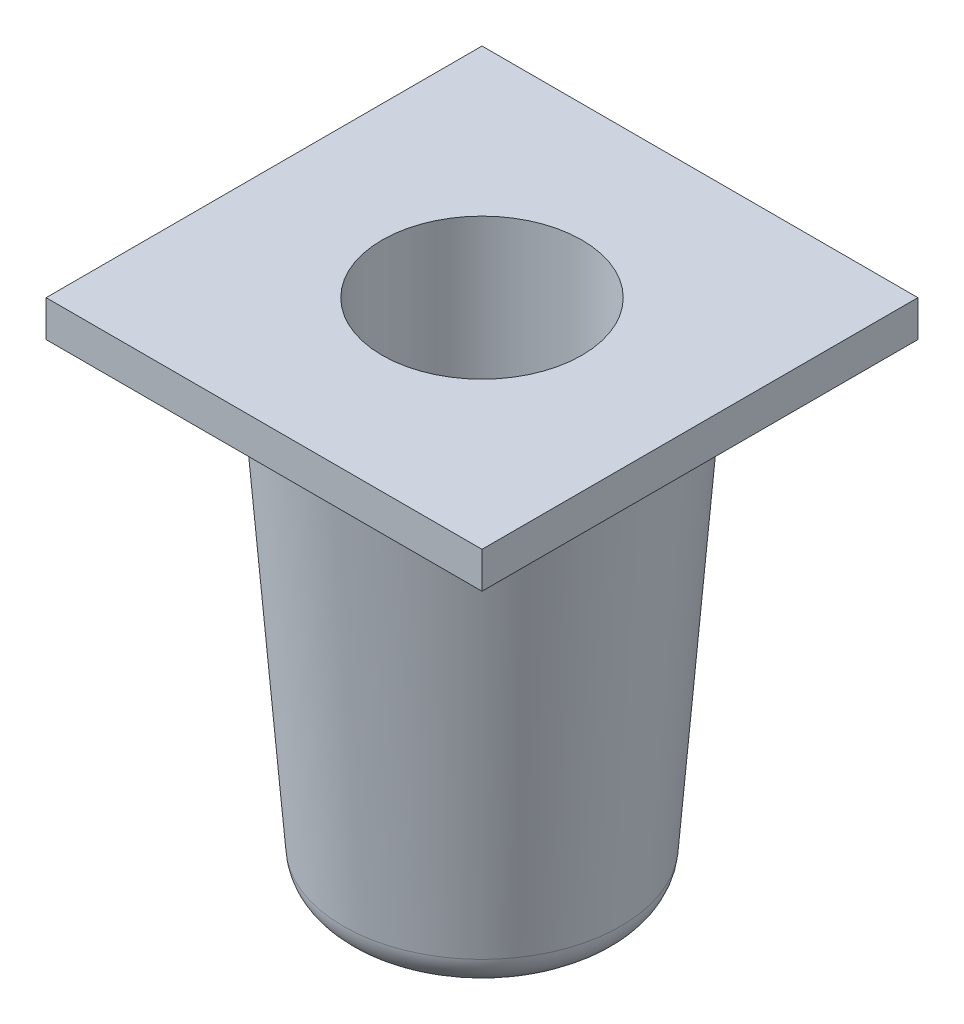
ISO-10303-21;
HEADER;
FILE_DESCRIPTION(('STEP AP214'),'2;1');
FILE_NAME('part.step','',(''),(''),'','','');
FILE_SCHEMA(('AUTOMOTIVE_DESIGN { 1 0 10303 214 1 1 1 1 }'));
ENDSEC;
DATA;
#1=APPLICATION_CONTEXT('core data for automotive mechanical design processes');
#2=APPLICATION_PROTOCOL_DEFINITION('international standard','automotive_design',2000,#1);
#3=PRODUCT_CONTEXT('',#1,'mechanical');
#4=PRODUCT('Part','Part','',(#3));
#5=PRODUCT_RELATED_PRODUCT_CATEGORY('part','',(#4));
#6=PRODUCT_DEFINITION_FORMATION('','',#4);
#7=PRODUCT_DEFINITION_CONTEXT('part definition',#1,'design');
#8=PRODUCT_DEFINITION('design','',#6,#7);
#9=PRODUCT_DEFINITION_SHAPE('','',#8);
#10=(LENGTH_UNIT() NAMED_UNIT(*) SI_UNIT(.MILLI.,.METRE.));
#11=(NAMED_UNIT(*) PLANE_ANGLE_UNIT() SI_UNIT($,.RADIAN.));
#12=(NAMED_UNIT(*) SI_UNIT($,.STERADIAN.) SOLID_ANGLE_UNIT());
#13=UNCERTAINTY_MEASURE_WITH_UNIT(LENGTH_MEASURE(1.E-05),#10,'distance_accuracy_value','');
#14=(GEOMETRIC_REPRESENTATION_CONTEXT(3) GLOBAL_UNCERTAINTY_ASSIGNED_CONTEXT((#13)) GLOBAL_UNIT_ASSIGNED_CONTEXT((#10,
#11,#12)) REPRESENTATION_CONTEXT('',''));
#15=CARTESIAN_POINT('',(0.,0.,0.));
#16=DIRECTION('',(0.,0.,1.));
#17=DIRECTION('',(1.,0.,0.));
#18=AXIS2_PLACEMENT_3D('',#15,#16,#17);
#19=CARTESIAN_POINT('',(0.,-12.,0.));
#20=DIRECTION('',(0.,1.,0.));
#21=DIRECTION('',(0.,0.,1.));
#22=AXIS2_PLACEMENT_3D('',#19,#20,#21);
#23=TOROIDAL_SURFACE('',#22,2.82387247076458,1.);
#24=CARTESIAN_POINT('',(0.,-13.,0.));
#25=DIRECTION('',(0.,1.,0.));
#26=DIRECTION('',(0.,0.,1.));
#27=AXIS2_PLACEMENT_3D('',#24,#25,#26);
#28=CIRCLE('',#27,2.82387247076458);
#29=CARTESIAN_POINT('',(0.,-13.,2.82387247076458));
#30=VERTEX_POINT('',#29);
#31=EDGE_CURVE('E46',#30,#30,#28,.F.);
#32=ORIENTED_EDGE('',*,*,#31,.F.);
#33=EDGE_LOOP('',(#32));
#34=FACE_BOUND('',#33,.T.);
#35=CARTESIAN_POINT('',(0.,-12.0765930263908,0.));
#36=DIRECTION('',(0.,-1.,0.));
#37=DIRECTION('',(0.,0.,-1.));
#38=AXIS2_PLACEMENT_3D('',#35,#36,#37);
#39=CIRCLE('',#38,3.82093491028795);
#40=CARTESIAN_POINT('',(0.,-12.0765930263908,-3.82093491028795));
#41=VERTEX_POINT('',#40);
#42=EDGE_CURVE('E11',#41,#41,#39,.F.);
#43=ORIENTED_EDGE('',*,*,#42,.F.);
#44=EDGE_LOOP('',(#43));
#45=FACE_BOUND('',#44,.T.);
#46=ADVANCED_FACE('F38',(#34,#45),#23,.T.);
#47=CARTESIAN_POINT('',(0.,1.,0.));
#48=DIRECTION('',(0.,-1.,0.));
#49=DIRECTION('',(0.,0.,-1.));
#50=AXIS2_PLACEMENT_3D('',#47,#48,#49);
#51=PLANE('',#50);
#52=DIRECTION('',(0.,0.,-1.));
#53=VECTOR('',#52,1.);
#54=CARTESIAN_POINT('',(6.00000000000002,1.,5.99999999999998));
#55=LINE('',#54,#53);
#56=CARTESIAN_POINT('',(6.00000000000002,1.,5.99999999999998));
#57=VERTEX_POINT('',#56);
#58=CARTESIAN_POINT('',(6.00000000000002,1.,-6.00000000000002));
#59=VERTEX_POINT('',#58);
#60=EDGE_CURVE('E91',#57,#59,#55,.T.);
#61=ORIENTED_EDGE('',*,*,#60,.T.);
#62=DIRECTION('',(-1.,0.,0.));
#63=VECTOR('',#62,1.);
#64=CARTESIAN_POINT('',(-5.99999999999999,1.,-6.00000000000003));
#65=LINE('',#64,#63);
#66=CARTESIAN_POINT('',(-5.99999999999999,1.,-6.00000000000003));
#67=VERTEX_POINT('',#66);
#68=EDGE_CURVE('E85',#59,#67,#65,.T.);
#69=ORIENTED_EDGE('',*,*,#68,.T.);
#70=DIRECTION('',(0.,0.,1.));
#71=VECTOR('',#70,1.);
#72=CARTESIAN_POINT('',(-5.99999999999999,1.,5.99999999999998));
#73=LINE('',#72,#71);
#74=CARTESIAN_POINT('',(-5.99999999999999,1.,5.99999999999998));
#75=VERTEX_POINT('',#74);
#76=EDGE_CURVE('E89',#67,#75,#73,.T.);
#77=ORIENTED_EDGE('',*,*,#76,.T.);
#78=DIRECTION('',(1.,0.,0.));
#79=VECTOR('',#78,1.);
#80=CARTESIAN_POINT('',(-5.99999999999999,1.,5.99999999999998));
#81=LINE('',#80,#79);
#82=EDGE_CURVE('E54',#75,#57,#81,.T.);
#83=ORIENTED_EDGE('',*,*,#82,.T.);
#84=EDGE_LOOP('',(#61,#69,#77,#83));
#85=FACE_BOUND('',#84,.T.);
#86=CARTESIAN_POINT('',(0.,1.,0.));
#87=DIRECTION('',(0.,1.,0.));
#88=DIRECTION('',(0.,0.,1.));
#89=AXIS2_PLACEMENT_3D('',#86,#87,#88);
#90=CIRCLE('',#89,2.75);
#91=CARTESIAN_POINT('',(0.,1.,2.74999999999998));
#92=VERTEX_POINT('',#91);
#93=EDGE_CURVE('E109',#92,#92,#90,.T.);
#94=ORIENTED_EDGE('',*,*,#93,.F.);
#95=EDGE_LOOP('',(#94));
#96=FACE_BOUND('',#95,.T.);
#97=ADVANCED_FACE('F86',(#85,#96),#51,.F.);
#98=CARTESIAN_POINT('',(0.,0.,0.));
#99=DIRECTION('',(0.,-1.,0.));
#100=DIRECTION('',(0.,0.,-1.));
#101=AXIS2_PLACEMENT_3D('',#98,#99,#100);
#102=PLANE('',#101);
#103=CARTESIAN_POINT('',(0.,0.,0.));
#104=DIRECTION('',(0.,1.,0.));
#105=DIRECTION('',(0.,0.,1.));
#106=AXIS2_PLACEMENT_3D('',#103,#104,#105);
#107=CIRCLE('',#106,4.7486429170433);
#108=CARTESIAN_POINT('',(0.,0.,4.7486429170433));
#109=VERTEX_POINT('',#108);
#110=EDGE_CURVE('E131',#109,#109,#107,.T.);
#111=ORIENTED_EDGE('',*,*,#110,.T.);
#112=EDGE_LOOP('',(#111));
#113=FACE_BOUND('',#112,.T.);
#114=DIRECTION('',(0.,0.,-1.));
#115=VECTOR('',#114,1.);
#116=CARTESIAN_POINT('',(6.00000000000002,0.,5.99999999999998));
#117=LINE('',#116,#115);
#118=CARTESIAN_POINT('',(6.00000000000002,0.,5.99999999999998));
#119=VERTEX_POINT('',#118);
#120=CARTESIAN_POINT('',(6.00000000000002,0.,-6.00000000000002));
#121=VERTEX_POINT('',#120);
#122=EDGE_CURVE('E106',#119,#121,#117,.T.);
#123=ORIENTED_EDGE('',*,*,#122,.F.);
#124=DIRECTION('',(1.,0.,0.));
#125=VECTOR('',#124,1.);
#126=CARTESIAN_POINT('',(-5.99999999999999,0.,5.99999999999998));
#127=LINE('',#126,#125);
#128=CARTESIAN_POINT('',(-5.99999999999999,0.,5.99999999999998));
#129=VERTEX_POINT('',#128);
#130=EDGE_CURVE('E77',#129,#119,#127,.T.);
#131=ORIENTED_EDGE('',*,*,#130,.F.);
#132=DIRECTION('',(0.,0.,1.));
#133=VECTOR('',#132,1.);
#134=CARTESIAN_POINT('',(-5.99999999999999,0.,5.99999999999998));
#135=LINE('',#134,#133);
#136=CARTESIAN_POINT('',(-5.99999999999999,0.,-6.00000000000003));
#137=VERTEX_POINT('',#136);
#138=EDGE_CURVE('E71',#137,#129,#135,.T.);
#139=ORIENTED_EDGE('',*,*,#138,.F.);
#140=DIRECTION('',(-1.,0.,0.));
#141=VECTOR('',#140,1.);
#142=CARTESIAN_POINT('',(-5.99999999999999,0.,-6.00000000000003));
#143=LINE('',#142,#141);
#144=EDGE_CURVE('E96',#121,#137,#143,.T.);
#145=ORIENTED_EDGE('',*,*,#144,.F.);
#146=EDGE_LOOP('',(#123,#131,#139,#145));
#147=FACE_BOUND('',#146,.T.);
#148=ADVANCED_FACE('F144',(#113,#147),#102,.T.);
#149=CARTESIAN_POINT('',(6.00000000000002,1.,5.99999999999998));
#150=DIRECTION('',(-1.,0.,0.));
#151=DIRECTION('',(0.,0.,1.));
#152=AXIS2_PLACEMENT_3D('',#149,#150,#151);
#153=PLANE('',#152);
#154=ORIENTED_EDGE('',*,*,#122,.T.);
#155=DIRECTION('',(0.,-1.,0.));
#156=VECTOR('',#155,1.);
#157=CARTESIAN_POINT('',(6.00000000000002,1.,-6.00000000000002));
#158=LINE('',#157,#156);
#159=EDGE_CURVE('E97',#59,#121,#158,.T.);
#160=ORIENTED_EDGE('',*,*,#159,.F.);
#161=ORIENTED_EDGE('',*,*,#60,.F.);
#162=DIRECTION('',(0.,-1.,0.));
#163=VECTOR('',#162,1.);
#164=CARTESIAN_POINT('',(6.00000000000002,1.,5.99999999999998));
#165=LINE('',#164,#163);
#166=EDGE_CURVE('E102',#57,#119,#165,.T.);
#167=ORIENTED_EDGE('',*,*,#166,.T.);
#168=EDGE_LOOP('',(#154,#160,#161,#167));
#169=FACE_BOUND('',#168,.T.);
#170=ADVANCED_FACE('F149',(#169),#153,.F.);
#171=CARTESIAN_POINT('',(-5.99999999999999,1.,-6.00000000000003));
#172=DIRECTION('',(0.,0.,1.));
#173=DIRECTION('',(1.,0.,0.));
#174=AXIS2_PLACEMENT_3D('',#171,#172,#173);
#175=PLANE('',#174);
#176=ORIENTED_EDGE('',*,*,#144,.T.);
#177=DIRECTION('',(0.,-1.,0.));
#178=VECTOR('',#177,1.);
#179=CARTESIAN_POINT('',(-5.99999999999999,1.,-6.00000000000003));
#180=LINE('',#179,#178);
#181=EDGE_CURVE('E94',#67,#137,#180,.T.);
#182=ORIENTED_EDGE('',*,*,#181,.F.);
#183=ORIENTED_EDGE('',*,*,#68,.F.);
#184=ORIENTED_EDGE('',*,*,#159,.T.);
#185=EDGE_LOOP('',(#176,#182,#183,#184));
#186=FACE_BOUND('',#185,.T.);
#187=ADVANCED_FACE('F95',(#186),#175,.F.);
#188=CARTESIAN_POINT('',(-5.99999999999999,1.,5.99999999999998));
#189=DIRECTION('',(1.,0.,0.));
#190=DIRECTION('',(0.,0.,-1.));
#191=AXIS2_PLACEMENT_3D('',#188,#189,#190);
#192=PLANE('',#191);
#193=ORIENTED_EDGE('',*,*,#138,.T.);
#194=DIRECTION('',(0.,-1.,0.));
#195=VECTOR('',#194,1.);
#196=CARTESIAN_POINT('',(-5.99999999999999,1.,5.99999999999998));
#197=LINE('',#196,#195);
#198=EDGE_CURVE('E98',#75,#129,#197,.T.);
#199=ORIENTED_EDGE('',*,*,#198,.F.);
#200=ORIENTED_EDGE('',*,*,#76,.F.);
#201=ORIENTED_EDGE('',*,*,#181,.T.);
#202=EDGE_LOOP('',(#193,#199,#200,#201));
#203=FACE_BOUND('',#202,.T.);
#204=ADVANCED_FACE('F100',(#203),#192,.F.);
#205=CARTESIAN_POINT('',(-5.99999999999999,1.,5.99999999999998));
#206=DIRECTION('',(0.,0.,-1.));
#207=DIRECTION('',(-1.,0.,0.));
#208=AXIS2_PLACEMENT_3D('',#205,#206,#207);
#209=PLANE('',#208);
#210=ORIENTED_EDGE('',*,*,#130,.T.);
#211=ORIENTED_EDGE('',*,*,#166,.F.);
#212=ORIENTED_EDGE('',*,*,#82,.F.);
#213=ORIENTED_EDGE('',*,*,#198,.T.);
#214=EDGE_LOOP('',(#210,#211,#212,#213));
#215=FACE_BOUND('',#214,.T.);
#216=ADVANCED_FACE('F154',(#215),#209,.F.);
#217=CARTESIAN_POINT('',(0.,1.,0.));
#218=DIRECTION('',(0.,-1.,0.));
#219=DIRECTION('',(0.,0.,-1.));
#220=AXIS2_PLACEMENT_3D('',#217,#218,#219);
#221=CYLINDRICAL_SURFACE('',#220,2.75);
#222=ORIENTED_EDGE('',*,*,#93,.T.);
#223=EDGE_LOOP('',(#222));
#224=FACE_BOUND('',#223,.T.);
#225=CARTESIAN_POINT('',(0.,-13.,0.));
#226=DIRECTION('',(0.,1.,0.));
#227=DIRECTION('',(0.,0.,1.));
#228=AXIS2_PLACEMENT_3D('',#225,#226,#227);
#229=CIRCLE('',#228,2.75000000000001);
#230=CARTESIAN_POINT('',(0.,-13.,2.75000000000001));
#231=VERTEX_POINT('',#230);
#232=EDGE_CURVE('E133',#231,#231,#229,.T.);
#233=ORIENTED_EDGE('',*,*,#232,.F.);
#234=EDGE_LOOP('',(#233));
#235=FACE_BOUND('',#234,.T.);
#236=ADVANCED_FACE('F141',(#224,#235),#221,.F.);
#237=CARTESIAN_POINT('',(3.75000000000001,-13.,0.));
#238=DIRECTION('',(0.,1.,0.));
#239=DIRECTION('',(0.,0.,1.));
#240=AXIS2_PLACEMENT_3D('',#237,#238,#239);
#241=PLANE('',#240);
#242=ORIENTED_EDGE('',*,*,#31,.T.);
#243=EDGE_LOOP('',(#242));
#244=FACE_BOUND('',#243,.T.);
#245=ORIENTED_EDGE('',*,*,#232,.T.);
#246=EDGE_LOOP('',(#245));
#247=FACE_BOUND('',#246,.T.);
#248=ADVANCED_FACE('F118',(#244,#247),#241,.F.);
#249=CARTESIAN_POINT('',(0.,-13.,0.));
#250=DIRECTION('',(0.,1.,0.));
#251=DIRECTION('',(0.,0.,1.));
#252=AXIS2_PLACEMENT_3D('',#249,#250,#251);
#253=CONICAL_SURFACE('',#252,3.75000000000001,0.0766681135097255);
#254=ORIENTED_EDGE('',*,*,#42,.T.);
#255=EDGE_LOOP('',(#254));
#256=FACE_BOUND('',#255,.T.);
#257=ORIENTED_EDGE('',*,*,#110,.F.);
#258=EDGE_LOOP('',(#257));
#259=FACE_BOUND('',#258,.T.);
#260=ADVANCED_FACE('F125',(#256,#259),#253,.T.);
#261=CLOSED_SHELL('',(#46,#97,#148,#170,#187,#204,#216,#236,#248,#260));
#262=MANIFOLD_SOLID_BREP('B2',#261);
#263=ADVANCED_BREP_SHAPE_REPRESENTATION('',(#18,#262),#14);
#264=SHAPE_DEFINITION_REPRESENTATION(#9,#263);
ENDSEC;
END-ISO-10303-21;
